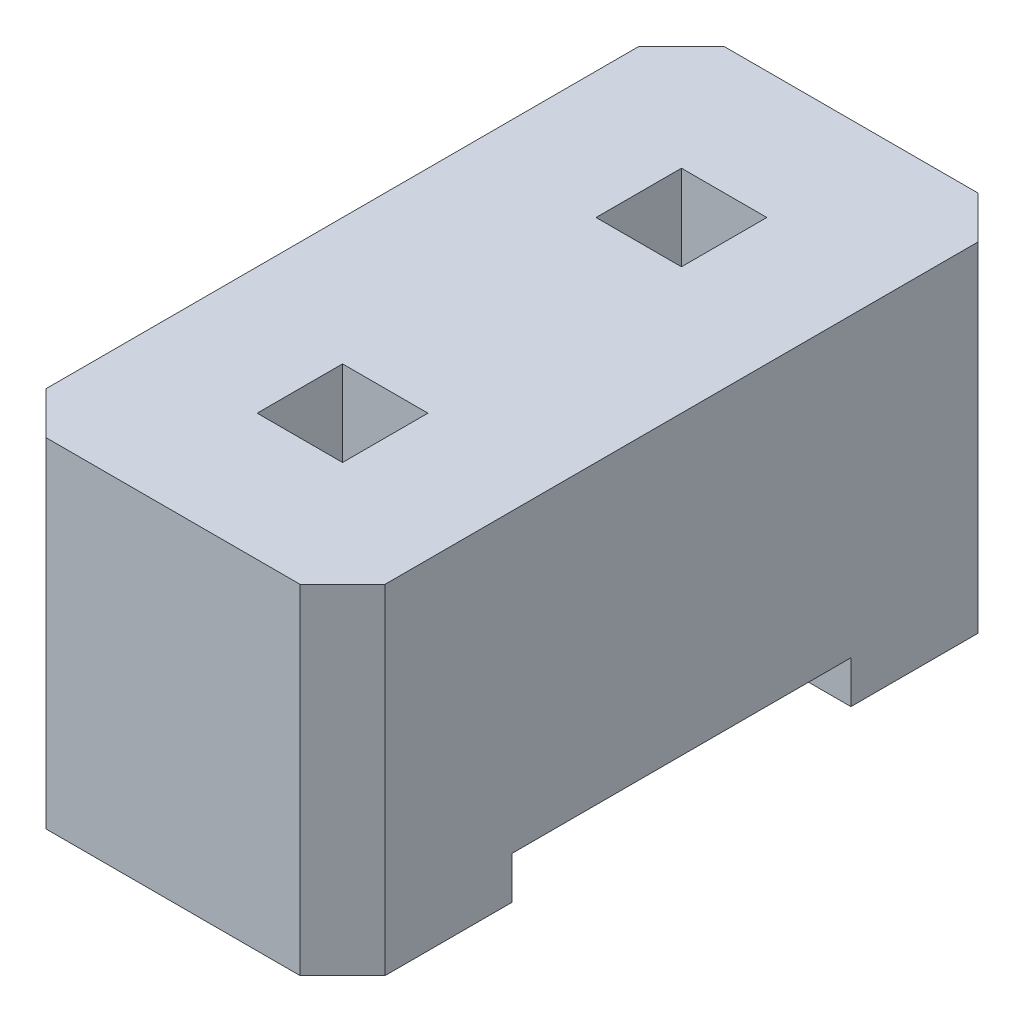
ISO-10303-21;
HEADER;
FILE_DESCRIPTION(('STEP AP214'),'2;1');
FILE_NAME('part.step','',(''),(''),'','','');
FILE_SCHEMA(('AUTOMOTIVE_DESIGN { 1 0 10303 214 1 1 1 1 }'));
ENDSEC;
DATA;
#1=APPLICATION_CONTEXT('core data for automotive mechanical design processes');
#2=APPLICATION_PROTOCOL_DEFINITION('international standard','automotive_design',2000,#1);
#3=PRODUCT_CONTEXT('',#1,'mechanical');
#4=PRODUCT('Part','Part','',(#3));
#5=PRODUCT_RELATED_PRODUCT_CATEGORY('part','',(#4));
#6=PRODUCT_DEFINITION_FORMATION('','',#4);
#7=PRODUCT_DEFINITION_CONTEXT('part definition',#1,'design');
#8=PRODUCT_DEFINITION('design','',#6,#7);
#9=PRODUCT_DEFINITION_SHAPE('','',#8);
#10=(LENGTH_UNIT() NAMED_UNIT(*) SI_UNIT(.MILLI.,.METRE.));
#11=(NAMED_UNIT(*) PLANE_ANGLE_UNIT() SI_UNIT($,.RADIAN.));
#12=(NAMED_UNIT(*) SI_UNIT($,.STERADIAN.) SOLID_ANGLE_UNIT());
#13=UNCERTAINTY_MEASURE_WITH_UNIT(LENGTH_MEASURE(1.E-05),#10,'distance_accuracy_value','');
#14=(GEOMETRIC_REPRESENTATION_CONTEXT(3) GLOBAL_UNCERTAINTY_ASSIGNED_CONTEXT((#13)) GLOBAL_UNIT_ASSIGNED_CONTEXT((#10,
#11,#12)) REPRESENTATION_CONTEXT('',''));
#15=CARTESIAN_POINT('',(0.,0.,0.));
#16=DIRECTION('',(0.,0.,1.));
#17=DIRECTION('',(1.,0.,0.));
#18=AXIS2_PLACEMENT_3D('',#15,#16,#17);
#19=CARTESIAN_POINT('',(-1.27,0.,2.54));
#20=DIRECTION('',(0.,0.,1.));
#21=DIRECTION('',(1.,0.,0.));
#22=AXIS2_PLACEMENT_3D('',#19,#20,#21);
#23=PLANE('',#22);
#24=DIRECTION('',(1.,0.,0.));
#25=VECTOR('',#24,1.);
#26=CARTESIAN_POINT('',(-1.27,0.3175,2.54));
#27=LINE('',#26,#25);
#28=CARTESIAN_POINT('',(-1.27,0.3175,2.54));
#29=VERTEX_POINT('',#28);
#30=CARTESIAN_POINT('',(-0.32,0.3175,2.54));
#31=VERTEX_POINT('',#30);
#32=EDGE_CURVE('E11',#29,#31,#27,.T.);
#33=ORIENTED_EDGE('',*,*,#32,.T.);
#34=DIRECTION('',(0.,-1.,0.));
#35=VECTOR('',#34,1.);
#36=CARTESIAN_POINT('',(-0.32,0.,2.54));
#37=LINE('',#36,#35);
#38=CARTESIAN_POINT('',(-0.32,0.,2.54));
#39=VERTEX_POINT('',#38);
#40=EDGE_CURVE('E27',#31,#39,#37,.T.);
#41=ORIENTED_EDGE('',*,*,#40,.T.);
#42=DIRECTION('',(1.,0.,0.));
#43=VECTOR('',#42,1.);
#44=CARTESIAN_POINT('',(-1.27,0.,2.54));
#45=LINE('',#44,#43);
#46=CARTESIAN_POINT('',(-1.27,0.,2.54));
#47=VERTEX_POINT('',#46);
#48=EDGE_CURVE('E298',#47,#39,#45,.T.);
#49=ORIENTED_EDGE('',*,*,#48,.F.);
#50=DIRECTION('',(0.,-1.,0.));
#51=VECTOR('',#50,1.);
#52=CARTESIAN_POINT('',(-1.27,0.,2.54));
#53=LINE('',#52,#51);
#54=EDGE_CURVE('E353',#29,#47,#53,.T.);
#55=ORIENTED_EDGE('',*,*,#54,.F.);
#56=EDGE_LOOP('',(#33,#41,#49,#55));
#57=FACE_BOUND('',#56,.T.);
#58=ADVANCED_FACE('F16',(#57),#23,.F.);
#59=CARTESIAN_POINT('',(0.,0.,0.));
#60=DIRECTION('',(0.,-1.,0.));
#61=DIRECTION('',(0.,0.,-1.));
#62=AXIS2_PLACEMENT_3D('',#59,#60,#61);
#63=PLANE('',#62);
#64=DIRECTION('',(0.,0.,1.));
#65=VECTOR('',#64,1.);
#66=CARTESIAN_POINT('',(-0.32,0.,2.86));
#67=LINE('',#66,#65);
#68=CARTESIAN_POINT('',(-0.32,0.,2.86));
#69=VERTEX_POINT('',#68);
#70=EDGE_CURVE('E312',#39,#69,#67,.T.);
#71=ORIENTED_EDGE('',*,*,#70,.T.);
#72=DIRECTION('',(1.,0.,0.));
#73=VECTOR('',#72,1.);
#74=CARTESIAN_POINT('',(-0.32,0.,2.86));
#75=LINE('',#74,#73);
#76=CARTESIAN_POINT('',(0.32,0.,2.86));
#77=VERTEX_POINT('',#76);
#78=EDGE_CURVE('E322',#69,#77,#75,.T.);
#79=ORIENTED_EDGE('',*,*,#78,.T.);
#80=DIRECTION('',(0.,0.,-1.));
#81=VECTOR('',#80,1.);
#82=CARTESIAN_POINT('',(0.32,0.,2.86));
#83=LINE('',#82,#81);
#84=CARTESIAN_POINT('',(0.32,0.,2.54));
#85=VERTEX_POINT('',#84);
#86=EDGE_CURVE('E248',#77,#85,#83,.T.);
#87=ORIENTED_EDGE('',*,*,#86,.T.);
#88=DIRECTION('',(1.,0.,0.));
#89=VECTOR('',#88,1.);
#90=CARTESIAN_POINT('',(-1.27,0.,2.54));
#91=LINE('',#90,#89);
#92=CARTESIAN_POINT('',(1.27,0.,2.54));
#93=VERTEX_POINT('',#92);
#94=EDGE_CURVE('E244',#85,#93,#91,.T.);
#95=ORIENTED_EDGE('',*,*,#94,.T.);
#96=DIRECTION('',(0.,0.,-1.));
#97=VECTOR('',#96,1.);
#98=CARTESIAN_POINT('',(1.27,0.,3.81));
#99=LINE('',#98,#97);
#100=CARTESIAN_POINT('',(1.27,0.,3.4925));
#101=VERTEX_POINT('',#100);
#102=EDGE_CURVE('E207',#101,#93,#99,.T.);
#103=ORIENTED_EDGE('',*,*,#102,.F.);
#104=DIRECTION('',(-0.70710678118655,0.,0.707106781186546));
#105=VECTOR('',#104,1.);
#106=CARTESIAN_POINT('',(2.38125,0.,2.38125));
#107=LINE('',#106,#105);
#108=CARTESIAN_POINT('',(0.9525,0.,3.81));
#109=VERTEX_POINT('',#108);
#110=EDGE_CURVE('E249',#101,#109,#107,.T.);
#111=ORIENTED_EDGE('',*,*,#110,.T.);
#112=DIRECTION('',(1.,0.,0.));
#113=VECTOR('',#112,1.);
#114=CARTESIAN_POINT('',(-1.27,0.,3.81));
#115=LINE('',#114,#113);
#116=CARTESIAN_POINT('',(-0.9525,0.,3.81));
#117=VERTEX_POINT('',#116);
#118=EDGE_CURVE('E414',#117,#109,#115,.T.);
#119=ORIENTED_EDGE('',*,*,#118,.F.);
#120=DIRECTION('',(-0.707106781186547,0.,-0.707106781186549));
#121=VECTOR('',#120,1.);
#122=CARTESIAN_POINT('',(-2.38125,0.,2.38125));
#123=LINE('',#122,#121);
#124=CARTESIAN_POINT('',(-1.27,0.,3.4925));
#125=VERTEX_POINT('',#124);
#126=EDGE_CURVE('E328',#117,#125,#123,.T.);
#127=ORIENTED_EDGE('',*,*,#126,.T.);
#128=DIRECTION('',(0.,0.,1.));
#129=VECTOR('',#128,1.);
#130=CARTESIAN_POINT('',(-1.27,0.,3.81));
#131=LINE('',#130,#129);
#132=EDGE_CURVE('E357',#47,#125,#131,.T.);
#133=ORIENTED_EDGE('',*,*,#132,.F.);
#134=ORIENTED_EDGE('',*,*,#48,.T.);
#135=EDGE_LOOP('',(#71,#79,#87,#95,#103,#111,#119,#127,#133,#134));
#136=FACE_BOUND('',#135,.T.);
#137=ADVANCED_FACE('F994',(#136),#63,.T.);
#138=CARTESIAN_POINT('',(0.,2.54,0.));
#139=DIRECTION('',(0.,-1.,0.));
#140=DIRECTION('',(0.,0.,-1.));
#141=AXIS2_PLACEMENT_3D('',#138,#139,#140);
#142=PLANE('',#141);
#143=DIRECTION('',(-1.,0.,0.));
#144=VECTOR('',#143,1.);
#145=CARTESIAN_POINT('',(-1.27,2.54,-1.27));
#146=LINE('',#145,#144);
#147=CARTESIAN_POINT('',(0.9525,2.54,-1.27));
#148=VERTEX_POINT('',#147);
#149=CARTESIAN_POINT('',(-0.9525,2.54,-1.27));
#150=VERTEX_POINT('',#149);
#151=EDGE_CURVE('E295',#148,#150,#146,.T.);
#152=ORIENTED_EDGE('',*,*,#151,.T.);
#153=DIRECTION('',(-0.707106781186549,0.,0.707106781186546));
#154=VECTOR('',#153,1.);
#155=CARTESIAN_POINT('',(-1.27,2.54,-0.9525));
#156=LINE('',#155,#154);
#157=CARTESIAN_POINT('',(-1.27,2.54,-0.9525));
#158=VERTEX_POINT('',#157);
#159=EDGE_CURVE('E242',#150,#158,#156,.T.);
#160=ORIENTED_EDGE('',*,*,#159,.T.);
#161=DIRECTION('',(0.,0.,1.));
#162=VECTOR('',#161,1.);
#163=CARTESIAN_POINT('',(-1.27,2.54,3.81));
#164=LINE('',#163,#162);
#165=CARTESIAN_POINT('',(-1.27,2.54,3.4925));
#166=VERTEX_POINT('',#165);
#167=EDGE_CURVE('E238',#158,#166,#164,.T.);
#168=ORIENTED_EDGE('',*,*,#167,.T.);
#169=DIRECTION('',(0.707106781186547,0.,0.707106781186549));
#170=VECTOR('',#169,1.);
#171=CARTESIAN_POINT('',(-0.9525,2.54,3.81));
#172=LINE('',#171,#170);
#173=CARTESIAN_POINT('',(-0.9525,2.54,3.81));
#174=VERTEX_POINT('',#173);
#175=EDGE_CURVE('E243',#166,#174,#172,.T.);
#176=ORIENTED_EDGE('',*,*,#175,.T.);
#177=DIRECTION('',(1.,0.,0.));
#178=VECTOR('',#177,1.);
#179=CARTESIAN_POINT('',(-1.27,2.54,3.81));
#180=LINE('',#179,#178);
#181=CARTESIAN_POINT('',(0.9525,2.54,3.81));
#182=VERTEX_POINT('',#181);
#183=EDGE_CURVE('E253',#174,#182,#180,.T.);
#184=ORIENTED_EDGE('',*,*,#183,.T.);
#185=DIRECTION('',(0.70710678118655,0.,-0.707106781186546));
#186=VECTOR('',#185,1.);
#187=CARTESIAN_POINT('',(1.27,2.54,3.4925));
#188=LINE('',#187,#186);
#189=CARTESIAN_POINT('',(1.27,2.54,3.4925));
#190=VERTEX_POINT('',#189);
#191=EDGE_CURVE('E231',#182,#190,#188,.T.);
#192=ORIENTED_EDGE('',*,*,#191,.T.);
#193=DIRECTION('',(0.,0.,-1.));
#194=VECTOR('',#193,1.);
#195=CARTESIAN_POINT('',(1.27,2.54,3.81));
#196=LINE('',#195,#194);
#197=CARTESIAN_POINT('',(1.27,2.54,-0.9525));
#198=VERTEX_POINT('',#197);
#199=EDGE_CURVE('E227',#190,#198,#196,.T.);
#200=ORIENTED_EDGE('',*,*,#199,.T.);
#201=DIRECTION('',(-0.707106781186547,0.,-0.707106781186549));
#202=VECTOR('',#201,1.);
#203=CARTESIAN_POINT('',(0.9525,2.54,-1.27));
#204=LINE('',#203,#202);
#205=EDGE_CURVE('E232',#198,#148,#204,.T.);
#206=ORIENTED_EDGE('',*,*,#205,.T.);
#207=EDGE_LOOP('',(#152,#160,#168,#176,#184,#192,#200,#206));
#208=FACE_BOUND('',#207,.T.);
#209=DIRECTION('',(1.,0.,0.));
#210=VECTOR('',#209,1.);
#211=CARTESIAN_POINT('',(-0.32,2.54,2.86));
#212=LINE('',#211,#210);
#213=CARTESIAN_POINT('',(-0.32,2.54,2.86));
#214=VERTEX_POINT('',#213);
#215=CARTESIAN_POINT('',(0.32,2.54,2.86));
#216=VERTEX_POINT('',#215);
#217=EDGE_CURVE('E276',#214,#216,#212,.T.);
#218=ORIENTED_EDGE('',*,*,#217,.F.);
#219=DIRECTION('',(0.,0.,1.));
#220=VECTOR('',#219,1.);
#221=CARTESIAN_POINT('',(-0.32,2.54,2.86));
#222=LINE('',#221,#220);
#223=CARTESIAN_POINT('',(-0.32,2.54,2.22));
#224=VERTEX_POINT('',#223);
#225=EDGE_CURVE('E329',#224,#214,#222,.T.);
#226=ORIENTED_EDGE('',*,*,#225,.F.);
#227=DIRECTION('',(-1.,0.,0.));
#228=VECTOR('',#227,1.);
#229=CARTESIAN_POINT('',(-0.32,2.54,2.22));
#230=LINE('',#229,#228);
#231=CARTESIAN_POINT('',(0.32,2.54,2.22));
#232=VERTEX_POINT('',#231);
#233=EDGE_CURVE('E371',#232,#224,#230,.T.);
#234=ORIENTED_EDGE('',*,*,#233,.F.);
#235=DIRECTION('',(0.,0.,-1.));
#236=VECTOR('',#235,1.);
#237=CARTESIAN_POINT('',(0.32,2.54,2.86));
#238=LINE('',#237,#236);
#239=EDGE_CURVE('E279',#216,#232,#238,.T.);
#240=ORIENTED_EDGE('',*,*,#239,.F.);
#241=EDGE_LOOP('',(#218,#226,#234,#240));
#242=FACE_BOUND('',#241,.T.);
#243=DIRECTION('',(0.,0.,-1.));
#244=VECTOR('',#243,1.);
#245=CARTESIAN_POINT('',(0.32,2.54,0.32));
#246=LINE('',#245,#244);
#247=CARTESIAN_POINT('',(0.32,2.54,0.32));
#248=VERTEX_POINT('',#247);
#249=CARTESIAN_POINT('',(0.32,2.54,-0.32));
#250=VERTEX_POINT('',#249);
#251=EDGE_CURVE('E258',#248,#250,#246,.T.);
#252=ORIENTED_EDGE('',*,*,#251,.F.);
#253=DIRECTION('',(1.,0.,0.));
#254=VECTOR('',#253,1.);
#255=CARTESIAN_POINT('',(-0.32,2.54,0.32));
#256=LINE('',#255,#254);
#257=CARTESIAN_POINT('',(-0.32,2.54,0.32));
#258=VERTEX_POINT('',#257);
#259=EDGE_CURVE('E319',#258,#248,#256,.T.);
#260=ORIENTED_EDGE('',*,*,#259,.F.);
#261=DIRECTION('',(0.,0.,1.));
#262=VECTOR('',#261,1.);
#263=CARTESIAN_POINT('',(-0.32,2.54,0.32));
#264=LINE('',#263,#262);
#265=CARTESIAN_POINT('',(-0.32,2.54,-0.32));
#266=VERTEX_POINT('',#265);
#267=EDGE_CURVE('E318',#266,#258,#264,.T.);
#268=ORIENTED_EDGE('',*,*,#267,.F.);
#269=DIRECTION('',(-1.,0.,0.));
#270=VECTOR('',#269,1.);
#271=CARTESIAN_POINT('',(-0.32,2.54,-0.32));
#272=LINE('',#271,#270);
#273=EDGE_CURVE('E281',#250,#266,#272,.T.);
#274=ORIENTED_EDGE('',*,*,#273,.F.);
#275=EDGE_LOOP('',(#252,#260,#268,#274));
#276=FACE_BOUND('',#275,.T.);
#277=ADVANCED_FACE('F984',(#208,#242,#276),#142,.F.);
#278=CARTESIAN_POINT('',(0.,0.,0.));
#279=DIRECTION('',(0.,-1.,0.));
#280=DIRECTION('',(0.,0.,-1.));
#281=AXIS2_PLACEMENT_3D('',#278,#279,#280);
#282=PLANE('',#281);
#283=DIRECTION('',(1.,0.,0.));
#284=VECTOR('',#283,1.);
#285=CARTESIAN_POINT('',(-1.27,0.,0.));
#286=LINE('',#285,#284);
#287=CARTESIAN_POINT('',(-1.27,0.,0.));
#288=VERTEX_POINT('',#287);
#289=CARTESIAN_POINT('',(-0.32,0.,0.));
#290=VERTEX_POINT('',#289);
#291=EDGE_CURVE('E372',#288,#290,#286,.T.);
#292=ORIENTED_EDGE('',*,*,#291,.F.);
#293=DIRECTION('',(0.,0.,1.));
#294=VECTOR('',#293,1.);
#295=CARTESIAN_POINT('',(-1.27,0.,3.81));
#296=LINE('',#295,#294);
#297=CARTESIAN_POINT('',(-1.27,0.,-0.9525));
#298=VERTEX_POINT('',#297);
#299=EDGE_CURVE('E264',#298,#288,#296,.T.);
#300=ORIENTED_EDGE('',*,*,#299,.F.);
#301=DIRECTION('',(0.707106781186549,0.,-0.707106781186546));
#302=VECTOR('',#301,1.);
#303=CARTESIAN_POINT('',(-1.11125,0.,-1.11125));
#304=LINE('',#303,#302);
#305=CARTESIAN_POINT('',(-0.9525,0.,-1.27));
#306=VERTEX_POINT('',#305);
#307=EDGE_CURVE('E254',#298,#306,#304,.T.);
#308=ORIENTED_EDGE('',*,*,#307,.T.);
#309=DIRECTION('',(-1.,0.,0.));
#310=VECTOR('',#309,1.);
#311=CARTESIAN_POINT('',(-1.27,0.,-1.27));
#312=LINE('',#311,#310);
#313=CARTESIAN_POINT('',(0.9525,0.,-1.27));
#314=VERTEX_POINT('',#313);
#315=EDGE_CURVE('E237',#314,#306,#312,.T.);
#316=ORIENTED_EDGE('',*,*,#315,.F.);
#317=DIRECTION('',(0.707106781186547,0.,0.707106781186549));
#318=VECTOR('',#317,1.);
#319=CARTESIAN_POINT('',(1.11125,0.,-1.11125));
#320=LINE('',#319,#318);
#321=CARTESIAN_POINT('',(1.27,0.,-0.9525));
#322=VERTEX_POINT('',#321);
#323=EDGE_CURVE('E20',#314,#322,#320,.T.);
#324=ORIENTED_EDGE('',*,*,#323,.T.);
#325=DIRECTION('',(0.,0.,-1.));
#326=VECTOR('',#325,1.);
#327=CARTESIAN_POINT('',(1.27,0.,3.81));
#328=LINE('',#327,#326);
#329=CARTESIAN_POINT('',(1.27,0.,0.));
#330=VERTEX_POINT('',#329);
#331=EDGE_CURVE('E200',#330,#322,#328,.T.);
#332=ORIENTED_EDGE('',*,*,#331,.F.);
#333=DIRECTION('',(1.,0.,0.));
#334=VECTOR('',#333,1.);
#335=CARTESIAN_POINT('',(-1.27,0.,0.));
#336=LINE('',#335,#334);
#337=CARTESIAN_POINT('',(0.32,0.,0.));
#338=VERTEX_POINT('',#337);
#339=EDGE_CURVE('E185',#338,#330,#336,.T.);
#340=ORIENTED_EDGE('',*,*,#339,.F.);
#341=DIRECTION('',(0.,0.,-1.));
#342=VECTOR('',#341,1.);
#343=CARTESIAN_POINT('',(0.32,0.,0.32));
#344=LINE('',#343,#342);
#345=CARTESIAN_POINT('',(0.32,0.,-0.32));
#346=VERTEX_POINT('',#345);
#347=EDGE_CURVE('E274',#338,#346,#344,.T.);
#348=ORIENTED_EDGE('',*,*,#347,.T.);
#349=DIRECTION('',(-1.,0.,0.));
#350=VECTOR('',#349,1.);
#351=CARTESIAN_POINT('',(-0.32,0.,-0.32));
#352=LINE('',#351,#350);
#353=CARTESIAN_POINT('',(-0.32,0.,-0.32));
#354=VERTEX_POINT('',#353);
#355=EDGE_CURVE('E270',#346,#354,#352,.T.);
#356=ORIENTED_EDGE('',*,*,#355,.T.);
#357=DIRECTION('',(0.,0.,1.));
#358=VECTOR('',#357,1.);
#359=CARTESIAN_POINT('',(-0.32,0.,0.32));
#360=LINE('',#359,#358);
#361=EDGE_CURVE('E275',#354,#290,#360,.T.);
#362=ORIENTED_EDGE('',*,*,#361,.T.);
#363=EDGE_LOOP('',(#292,#300,#308,#316,#324,#332,#340,#348,#356,#362));
#364=FACE_BOUND('',#363,.T.);
#365=ADVANCED_FACE('F201',(#364),#282,.T.);
#366=CARTESIAN_POINT('',(1.27,2.54,3.81));
#367=DIRECTION('',(-1.,0.,0.));
#368=DIRECTION('',(0.,0.,1.));
#369=AXIS2_PLACEMENT_3D('',#366,#367,#368);
#370=PLANE('',#369);
#371=ORIENTED_EDGE('',*,*,#102,.T.);
#372=DIRECTION('',(0.,-1.,0.));
#373=VECTOR('',#372,1.);
#374=CARTESIAN_POINT('',(1.27,0.,2.54));
#375=LINE('',#374,#373);
#376=CARTESIAN_POINT('',(1.27,0.3175,2.54));
#377=VERTEX_POINT('',#376);
#378=EDGE_CURVE('E349',#377,#93,#375,.T.);
#379=ORIENTED_EDGE('',*,*,#378,.F.);
#380=DIRECTION('',(0.,0.,1.));
#381=VECTOR('',#380,1.);
#382=CARTESIAN_POINT('',(1.27,0.3175,2.54));
#383=LINE('',#382,#381);
#384=CARTESIAN_POINT('',(1.27,0.3175,0.));
#385=VERTEX_POINT('',#384);
#386=EDGE_CURVE('E213',#385,#377,#383,.T.);
#387=ORIENTED_EDGE('',*,*,#386,.F.);
#388=DIRECTION('',(0.,1.,0.));
#389=VECTOR('',#388,1.);
#390=CARTESIAN_POINT('',(1.27,0.,0.));
#391=LINE('',#390,#389);
#392=EDGE_CURVE('E190',#330,#385,#391,.T.);
#393=ORIENTED_EDGE('',*,*,#392,.F.);
#394=ORIENTED_EDGE('',*,*,#331,.T.);
#395=DIRECTION('',(0.,1.,0.));
#396=VECTOR('',#395,1.);
#397=CARTESIAN_POINT('',(1.27,2.54,-0.9525));
#398=LINE('',#397,#396);
#399=EDGE_CURVE('E208',#322,#198,#398,.T.);
#400=ORIENTED_EDGE('',*,*,#399,.T.);
#401=ORIENTED_EDGE('',*,*,#199,.F.);
#402=DIRECTION('',(0.,-1.,0.));
#403=VECTOR('',#402,1.);
#404=CARTESIAN_POINT('',(1.27,2.54,3.4925));
#405=LINE('',#404,#403);
#406=EDGE_CURVE('E233',#190,#101,#405,.T.);
#407=ORIENTED_EDGE('',*,*,#406,.T.);
#408=EDGE_LOOP('',(#371,#379,#387,#393,#394,#400,#401,#407));
#409=FACE_BOUND('',#408,.T.);
#410=ADVANCED_FACE('F210',(#409),#370,.F.);
#411=CARTESIAN_POINT('',(-1.27,2.54,-1.27));
#412=DIRECTION('',(0.,0.,1.));
#413=DIRECTION('',(1.,0.,0.));
#414=AXIS2_PLACEMENT_3D('',#411,#412,#413);
#415=PLANE('',#414);
#416=ORIENTED_EDGE('',*,*,#315,.T.);
#417=DIRECTION('',(0.,1.,0.));
#418=VECTOR('',#417,1.);
#419=CARTESIAN_POINT('',(-0.9525,2.54,-1.27));
#420=LINE('',#419,#418);
#421=EDGE_CURVE('E293',#306,#150,#420,.T.);
#422=ORIENTED_EDGE('',*,*,#421,.T.);
#423=ORIENTED_EDGE('',*,*,#151,.F.);
#424=DIRECTION('',(0.,-1.,0.));
#425=VECTOR('',#424,1.);
#426=CARTESIAN_POINT('',(0.9525,2.54,-1.27));
#427=LINE('',#426,#425);
#428=EDGE_CURVE('E289',#148,#314,#427,.T.);
#429=ORIENTED_EDGE('',*,*,#428,.T.);
#430=EDGE_LOOP('',(#416,#422,#423,#429));
#431=FACE_BOUND('',#430,.T.);
#432=ADVANCED_FACE('F955',(#431),#415,.F.);
#433=CARTESIAN_POINT('',(-1.27,2.54,3.81));
#434=DIRECTION('',(1.,0.,0.));
#435=DIRECTION('',(0.,1.,0.));
#436=AXIS2_PLACEMENT_3D('',#433,#434,#435);
#437=PLANE('',#436);
#438=DIRECTION('',(0.,0.,1.));
#439=VECTOR('',#438,1.);
#440=CARTESIAN_POINT('',(-1.27,0.3175,2.54));
#441=LINE('',#440,#439);
#442=CARTESIAN_POINT('',(-1.27,0.3175,0.));
#443=VERTEX_POINT('',#442);
#444=EDGE_CURVE('E294',#443,#29,#441,.T.);
#445=ORIENTED_EDGE('',*,*,#444,.T.);
#446=ORIENTED_EDGE('',*,*,#54,.T.);
#447=ORIENTED_EDGE('',*,*,#132,.T.);
#448=DIRECTION('',(0.,1.,0.));
#449=VECTOR('',#448,1.);
#450=CARTESIAN_POINT('',(-1.27,2.54,3.4925));
#451=LINE('',#450,#449);
#452=EDGE_CURVE('E407',#125,#166,#451,.T.);
#453=ORIENTED_EDGE('',*,*,#452,.T.);
#454=ORIENTED_EDGE('',*,*,#167,.F.);
#455=DIRECTION('',(0.,-1.,0.));
#456=VECTOR('',#455,1.);
#457=CARTESIAN_POINT('',(-1.27,2.54,-0.9525));
#458=LINE('',#457,#456);
#459=EDGE_CURVE('E268',#158,#298,#458,.T.);
#460=ORIENTED_EDGE('',*,*,#459,.T.);
#461=ORIENTED_EDGE('',*,*,#299,.T.);
#462=DIRECTION('',(0.,1.,0.));
#463=VECTOR('',#462,1.);
#464=CARTESIAN_POINT('',(-1.27,0.,0.));
#465=LINE('',#464,#463);
#466=EDGE_CURVE('E269',#288,#443,#465,.T.);
#467=ORIENTED_EDGE('',*,*,#466,.T.);
#468=EDGE_LOOP('',(#445,#446,#447,#453,#454,#460,#461,#467));
#469=FACE_BOUND('',#468,.T.);
#470=ADVANCED_FACE('F944',(#469),#437,.F.);
#471=CARTESIAN_POINT('',(-1.27,2.54,3.81));
#472=DIRECTION('',(0.,0.,-1.));
#473=DIRECTION('',(0.,-1.,0.));
#474=AXIS2_PLACEMENT_3D('',#471,#472,#473);
#475=PLANE('',#474);
#476=ORIENTED_EDGE('',*,*,#183,.F.);
#477=DIRECTION('',(0.,-1.,0.));
#478=VECTOR('',#477,1.);
#479=CARTESIAN_POINT('',(-0.9525,2.54,3.81));
#480=LINE('',#479,#478);
#481=EDGE_CURVE('E288',#174,#117,#480,.T.);
#482=ORIENTED_EDGE('',*,*,#481,.T.);
#483=ORIENTED_EDGE('',*,*,#118,.T.);
#484=DIRECTION('',(0.,1.,0.));
#485=VECTOR('',#484,1.);
#486=CARTESIAN_POINT('',(0.9525,2.54,3.81));
#487=LINE('',#486,#485);
#488=EDGE_CURVE('E262',#109,#182,#487,.T.);
#489=ORIENTED_EDGE('',*,*,#488,.T.);
#490=EDGE_LOOP('',(#476,#482,#483,#489));
#491=FACE_BOUND('',#490,.T.);
#492=ADVANCED_FACE('F933',(#491),#475,.F.);
#493=CARTESIAN_POINT('',(0.32,2.54,0.32));
#494=DIRECTION('',(-1.,0.,0.));
#495=DIRECTION('',(0.,0.,1.));
#496=AXIS2_PLACEMENT_3D('',#493,#494,#495);
#497=PLANE('',#496);
#498=DIRECTION('',(0.,0.,-1.));
#499=VECTOR('',#498,1.);
#500=CARTESIAN_POINT('',(0.32,0.3175,0.32));
#501=LINE('',#500,#499);
#502=CARTESIAN_POINT('',(0.32,0.3175,0.32));
#503=VERTEX_POINT('',#502);
#504=CARTESIAN_POINT('',(0.32,0.3175,0.));
#505=VERTEX_POINT('',#504);
#506=EDGE_CURVE('E345',#503,#505,#501,.T.);
#507=ORIENTED_EDGE('',*,*,#506,.F.);
#508=DIRECTION('',(0.,-1.,0.));
#509=VECTOR('',#508,1.);
#510=CARTESIAN_POINT('',(0.32,2.54,0.32));
#511=LINE('',#510,#509);
#512=EDGE_CURVE('E360',#248,#503,#511,.T.);
#513=ORIENTED_EDGE('',*,*,#512,.F.);
#514=ORIENTED_EDGE('',*,*,#251,.T.);
#515=DIRECTION('',(0.,-1.,0.));
#516=VECTOR('',#515,1.);
#517=CARTESIAN_POINT('',(0.32,2.54,-0.32));
#518=LINE('',#517,#516);
#519=EDGE_CURVE('E263',#250,#346,#518,.T.);
#520=ORIENTED_EDGE('',*,*,#519,.T.);
#521=ORIENTED_EDGE('',*,*,#347,.F.);
#522=DIRECTION('',(0.,-1.,0.));
#523=VECTOR('',#522,1.);
#524=CARTESIAN_POINT('',(0.32,2.54,0.));
#525=LINE('',#524,#523);
#526=EDGE_CURVE('E193',#505,#338,#525,.T.);
#527=ORIENTED_EDGE('',*,*,#526,.F.);
#528=EDGE_LOOP('',(#507,#513,#514,#520,#521,#527));
#529=FACE_BOUND('',#528,.T.);
#530=ADVANCED_FACE('F922',(#529),#497,.T.);
#531=CARTESIAN_POINT('',(-0.32,2.54,-0.32));
#532=DIRECTION('',(0.,0.,1.));
#533=DIRECTION('',(1.,0.,0.));
#534=AXIS2_PLACEMENT_3D('',#531,#532,#533);
#535=PLANE('',#534);
#536=ORIENTED_EDGE('',*,*,#355,.F.);
#537=ORIENTED_EDGE('',*,*,#519,.F.);
#538=ORIENTED_EDGE('',*,*,#273,.T.);
#539=DIRECTION('',(0.,-1.,0.));
#540=VECTOR('',#539,1.);
#541=CARTESIAN_POINT('',(-0.32,2.54,-0.32));
#542=LINE('',#541,#540);
#543=EDGE_CURVE('E285',#266,#354,#542,.T.);
#544=ORIENTED_EDGE('',*,*,#543,.T.);
#545=EDGE_LOOP('',(#536,#537,#538,#544));
#546=FACE_BOUND('',#545,.T.);
#547=ADVANCED_FACE('F911',(#546),#535,.T.);
#548=CARTESIAN_POINT('',(-0.32,2.54,0.32));
#549=DIRECTION('',(1.,0.,0.));
#550=DIRECTION('',(0.,1.,0.));
#551=AXIS2_PLACEMENT_3D('',#548,#549,#550);
#552=PLANE('',#551);
#553=DIRECTION('',(0.,0.,1.));
#554=VECTOR('',#553,1.);
#555=CARTESIAN_POINT('',(-0.32,0.3175,0.32));
#556=LINE('',#555,#554);
#557=CARTESIAN_POINT('',(-0.32,0.3175,0.));
#558=VERTEX_POINT('',#557);
#559=CARTESIAN_POINT('',(-0.32,0.3175,0.32));
#560=VERTEX_POINT('',#559);
#561=EDGE_CURVE('E340',#558,#560,#556,.T.);
#562=ORIENTED_EDGE('',*,*,#561,.F.);
#563=DIRECTION('',(0.,1.,0.));
#564=VECTOR('',#563,1.);
#565=CARTESIAN_POINT('',(-0.32,2.54,0.));
#566=LINE('',#565,#564);
#567=EDGE_CURVE('E375',#290,#558,#566,.T.);
#568=ORIENTED_EDGE('',*,*,#567,.F.);
#569=ORIENTED_EDGE('',*,*,#361,.F.);
#570=ORIENTED_EDGE('',*,*,#543,.F.);
#571=ORIENTED_EDGE('',*,*,#267,.T.);
#572=DIRECTION('',(0.,-1.,0.));
#573=VECTOR('',#572,1.);
#574=CARTESIAN_POINT('',(-0.32,2.54,0.32));
#575=LINE('',#574,#573);
#576=EDGE_CURVE('E314',#258,#560,#575,.T.);
#577=ORIENTED_EDGE('',*,*,#576,.T.);
#578=EDGE_LOOP('',(#562,#568,#569,#570,#571,#577));
#579=FACE_BOUND('',#578,.T.);
#580=ADVANCED_FACE('F467',(#579),#552,.T.);
#581=CARTESIAN_POINT('',(-0.32,2.54,0.32));
#582=DIRECTION('',(0.,0.,-1.));
#583=DIRECTION('',(0.,-1.,0.));
#584=AXIS2_PLACEMENT_3D('',#581,#582,#583);
#585=PLANE('',#584);
#586=DIRECTION('',(1.,0.,0.));
#587=VECTOR('',#586,1.);
#588=CARTESIAN_POINT('',(-0.32,0.3175,0.32));
#589=LINE('',#588,#587);
#590=EDGE_CURVE('E341',#560,#503,#589,.T.);
#591=ORIENTED_EDGE('',*,*,#590,.F.);
#592=ORIENTED_EDGE('',*,*,#576,.F.);
#593=ORIENTED_EDGE('',*,*,#259,.T.);
#594=ORIENTED_EDGE('',*,*,#512,.T.);
#595=EDGE_LOOP('',(#591,#592,#593,#594));
#596=FACE_BOUND('',#595,.T.);
#597=ADVANCED_FACE('F889',(#596),#585,.T.);
#598=CARTESIAN_POINT('',(-1.27,2.54,-0.9525));
#599=DIRECTION('',(0.707106781186546,0.,0.707106781186549));
#600=DIRECTION('',(0.,-1.,0.));
#601=AXIS2_PLACEMENT_3D('',#598,#599,#600);
#602=PLANE('',#601);
#603=ORIENTED_EDGE('',*,*,#159,.F.);
#604=ORIENTED_EDGE('',*,*,#421,.F.);
#605=ORIENTED_EDGE('',*,*,#307,.F.);
#606=ORIENTED_EDGE('',*,*,#459,.F.);
#607=EDGE_LOOP('',(#603,#604,#605,#606));
#608=FACE_BOUND('',#607,.T.);
#609=ADVANCED_FACE('F878',(#608),#602,.F.);
#610=CARTESIAN_POINT('',(-0.9525,2.54,3.81));
#611=DIRECTION('',(0.707106781186549,0.,-0.707106781186547));
#612=DIRECTION('',(0.,-1.,0.));
#613=AXIS2_PLACEMENT_3D('',#610,#611,#612);
#614=PLANE('',#613);
#615=ORIENTED_EDGE('',*,*,#175,.F.);
#616=ORIENTED_EDGE('',*,*,#452,.F.);
#617=ORIENTED_EDGE('',*,*,#126,.F.);
#618=ORIENTED_EDGE('',*,*,#481,.F.);
#619=EDGE_LOOP('',(#615,#616,#617,#618));
#620=FACE_BOUND('',#619,.T.);
#621=ADVANCED_FACE('F865',(#620),#614,.F.);
#622=CARTESIAN_POINT('',(0.9525,2.54,-1.27));
#623=DIRECTION('',(-0.707106781186548,0.,0.707106781186547));
#624=DIRECTION('',(0.,1.,0.));
#625=AXIS2_PLACEMENT_3D('',#622,#623,#624);
#626=PLANE('',#625);
#627=ORIENTED_EDGE('',*,*,#205,.F.);
#628=ORIENTED_EDGE('',*,*,#399,.F.);
#629=ORIENTED_EDGE('',*,*,#323,.F.);
#630=ORIENTED_EDGE('',*,*,#428,.F.);
#631=EDGE_LOOP('',(#627,#628,#629,#630));
#632=FACE_BOUND('',#631,.T.);
#633=ADVANCED_FACE('F851',(#632),#626,.F.);
#634=CARTESIAN_POINT('',(1.27,2.54,3.4925));
#635=DIRECTION('',(-0.707106781186546,0.,-0.70710678118655));
#636=DIRECTION('',(-0.70710678118655,0.,0.707106781186546));
#637=AXIS2_PLACEMENT_3D('',#634,#635,#636);
#638=PLANE('',#637);
#639=ORIENTED_EDGE('',*,*,#191,.F.);
#640=ORIENTED_EDGE('',*,*,#488,.F.);
#641=ORIENTED_EDGE('',*,*,#110,.F.);
#642=ORIENTED_EDGE('',*,*,#406,.F.);
#643=EDGE_LOOP('',(#639,#640,#641,#642));
#644=FACE_BOUND('',#643,.T.);
#645=ADVANCED_FACE('F839',(#644),#638,.F.);
#646=CARTESIAN_POINT('',(-1.27,0.,0.));
#647=DIRECTION('',(0.,0.,-1.));
#648=DIRECTION('',(-1.,0.,0.));
#649=AXIS2_PLACEMENT_3D('',#646,#647,#648);
#650=PLANE('',#649);
#651=ORIENTED_EDGE('',*,*,#526,.T.);
#652=ORIENTED_EDGE('',*,*,#339,.T.);
#653=ORIENTED_EDGE('',*,*,#392,.T.);
#654=DIRECTION('',(1.,0.,0.));
#655=VECTOR('',#654,1.);
#656=CARTESIAN_POINT('',(-1.27,0.3175,0.));
#657=LINE('',#656,#655);
#658=EDGE_CURVE('E1295',#505,#385,#657,.T.);
#659=ORIENTED_EDGE('',*,*,#658,.F.);
#660=EDGE_LOOP('',(#651,#652,#653,#659));
#661=FACE_BOUND('',#660,.T.);
#662=ADVANCED_FACE('F187',(#661),#650,.F.);
#663=CARTESIAN_POINT('',(-1.27,0.,2.54));
#664=DIRECTION('',(0.,0.,1.));
#665=DIRECTION('',(1.,0.,0.));
#666=AXIS2_PLACEMENT_3D('',#663,#664,#665);
#667=PLANE('',#666);
#668=ORIENTED_EDGE('',*,*,#94,.F.);
#669=DIRECTION('',(0.,1.,0.));
#670=VECTOR('',#669,1.);
#671=CARTESIAN_POINT('',(0.32,0.,2.54));
#672=LINE('',#671,#670);
#673=CARTESIAN_POINT('',(0.32,0.3175,2.54));
#674=VERTEX_POINT('',#673);
#675=EDGE_CURVE('E215',#85,#674,#672,.T.);
#676=ORIENTED_EDGE('',*,*,#675,.T.);
#677=DIRECTION('',(1.,0.,0.));
#678=VECTOR('',#677,1.);
#679=CARTESIAN_POINT('',(-1.27,0.3175,2.54));
#680=LINE('',#679,#678);
#681=EDGE_CURVE('E222',#674,#377,#680,.T.);
#682=ORIENTED_EDGE('',*,*,#681,.T.);
#683=ORIENTED_EDGE('',*,*,#378,.T.);
#684=EDGE_LOOP('',(#668,#676,#682,#683));
#685=FACE_BOUND('',#684,.T.);
#686=ADVANCED_FACE('F814',(#685),#667,.F.);
#687=CARTESIAN_POINT('',(-1.27,0.3175,2.54));
#688=DIRECTION('',(0.,1.,0.));
#689=DIRECTION('',(1.,0.,0.));
#690=AXIS2_PLACEMENT_3D('',#687,#688,#689);
#691=PLANE('',#690);
#692=DIRECTION('',(-1.,0.,0.));
#693=VECTOR('',#692,1.);
#694=CARTESIAN_POINT('',(-1.27,0.3175,2.22));
#695=LINE('',#694,#693);
#696=CARTESIAN_POINT('',(0.32,0.3175,2.22));
#697=VERTEX_POINT('',#696);
#698=CARTESIAN_POINT('',(-0.32,0.3175,2.22));
#699=VERTEX_POINT('',#698);
#700=EDGE_CURVE('E380',#697,#699,#695,.T.);
#701=ORIENTED_EDGE('',*,*,#700,.T.);
#702=DIRECTION('',(0.,0.,1.));
#703=VECTOR('',#702,1.);
#704=CARTESIAN_POINT('',(-0.32,0.3175,2.54));
#705=LINE('',#704,#703);
#706=EDGE_CURVE('E339',#699,#31,#705,.T.);
#707=ORIENTED_EDGE('',*,*,#706,.T.);
#708=ORIENTED_EDGE('',*,*,#32,.F.);
#709=ORIENTED_EDGE('',*,*,#444,.F.);
#710=DIRECTION('',(1.,0.,0.));
#711=VECTOR('',#710,1.);
#712=CARTESIAN_POINT('',(-1.27,0.3175,0.));
#713=LINE('',#712,#711);
#714=EDGE_CURVE('E335',#443,#558,#713,.T.);
#715=ORIENTED_EDGE('',*,*,#714,.T.);
#716=ORIENTED_EDGE('',*,*,#561,.T.);
#717=ORIENTED_EDGE('',*,*,#590,.T.);
#718=ORIENTED_EDGE('',*,*,#506,.T.);
#719=ORIENTED_EDGE('',*,*,#658,.T.);
#720=ORIENTED_EDGE('',*,*,#386,.T.);
#721=ORIENTED_EDGE('',*,*,#681,.F.);
#722=DIRECTION('',(0.,0.,-1.));
#723=VECTOR('',#722,1.);
#724=CARTESIAN_POINT('',(0.32,0.3175,2.54));
#725=LINE('',#724,#723);
#726=EDGE_CURVE('E454',#674,#697,#725,.T.);
#727=ORIENTED_EDGE('',*,*,#726,.T.);
#728=EDGE_LOOP('',(#701,#707,#708,#709,#715,#716,#717,#718,#719,#720,#721,#727));
#729=FACE_BOUND('',#728,.T.);
#730=ADVANCED_FACE('F802',(#729),#691,.F.);
#731=CARTESIAN_POINT('',(-1.27,0.,0.));
#732=DIRECTION('',(0.,0.,-1.));
#733=DIRECTION('',(-1.,0.,0.));
#734=AXIS2_PLACEMENT_3D('',#731,#732,#733);
#735=PLANE('',#734);
#736=ORIENTED_EDGE('',*,*,#567,.T.);
#737=ORIENTED_EDGE('',*,*,#714,.F.);
#738=ORIENTED_EDGE('',*,*,#466,.F.);
#739=ORIENTED_EDGE('',*,*,#291,.T.);
#740=EDGE_LOOP('',(#736,#737,#738,#739));
#741=FACE_BOUND('',#740,.T.);
#742=ADVANCED_FACE('F791',(#741),#735,.F.);
#743=CARTESIAN_POINT('',(-0.32,0.,2.86));
#744=DIRECTION('',(-1.,0.,0.));
#745=DIRECTION('',(0.,0.,1.));
#746=AXIS2_PLACEMENT_3D('',#743,#744,#745);
#747=PLANE('',#746);
#748=ORIENTED_EDGE('',*,*,#706,.F.);
#749=DIRECTION('',(0.,1.,0.));
#750=VECTOR('',#749,1.);
#751=CARTESIAN_POINT('',(-0.32,0.,2.22));
#752=LINE('',#751,#750);
#753=EDGE_CURVE('E333',#699,#224,#752,.T.);
#754=ORIENTED_EDGE('',*,*,#753,.T.);
#755=ORIENTED_EDGE('',*,*,#225,.T.);
#756=DIRECTION('',(0.,1.,0.));
#757=VECTOR('',#756,1.);
#758=CARTESIAN_POINT('',(-0.32,0.,2.86));
#759=LINE('',#758,#757);
#760=EDGE_CURVE('E280',#69,#214,#759,.T.);
#761=ORIENTED_EDGE('',*,*,#760,.F.);
#762=ORIENTED_EDGE('',*,*,#70,.F.);
#763=ORIENTED_EDGE('',*,*,#40,.F.);
#764=EDGE_LOOP('',(#748,#754,#755,#761,#762,#763));
#765=FACE_BOUND('',#764,.T.);
#766=ADVANCED_FACE('F780',(#765),#747,.F.);
#767=CARTESIAN_POINT('',(-0.32,0.,2.22));
#768=DIRECTION('',(0.,0.,-1.));
#769=DIRECTION('',(0.,-1.,0.));
#770=AXIS2_PLACEMENT_3D('',#767,#768,#769);
#771=PLANE('',#770);
#772=DIRECTION('',(0.,1.,0.));
#773=VECTOR('',#772,1.);
#774=CARTESIAN_POINT('',(0.32,0.,2.22));
#775=LINE('',#774,#773);
#776=EDGE_CURVE('E334',#697,#232,#775,.T.);
#777=ORIENTED_EDGE('',*,*,#776,.T.);
#778=ORIENTED_EDGE('',*,*,#233,.T.);
#779=ORIENTED_EDGE('',*,*,#753,.F.);
#780=ORIENTED_EDGE('',*,*,#700,.F.);
#781=EDGE_LOOP('',(#777,#778,#779,#780));
#782=FACE_BOUND('',#781,.T.);
#783=ADVANCED_FACE('F18',(#782),#771,.F.);
#784=CARTESIAN_POINT('',(0.32,0.,2.86));
#785=DIRECTION('',(1.,0.,0.));
#786=DIRECTION('',(0.,1.,0.));
#787=AXIS2_PLACEMENT_3D('',#784,#785,#786);
#788=PLANE('',#787);
#789=ORIENTED_EDGE('',*,*,#86,.F.);
#790=DIRECTION('',(0.,1.,0.));
#791=VECTOR('',#790,1.);
#792=CARTESIAN_POINT('',(0.32,0.,2.86));
#793=LINE('',#792,#791);
#794=EDGE_CURVE('E367',#77,#216,#793,.T.);
#795=ORIENTED_EDGE('',*,*,#794,.T.);
#796=ORIENTED_EDGE('',*,*,#239,.T.);
#797=ORIENTED_EDGE('',*,*,#776,.F.);
#798=ORIENTED_EDGE('',*,*,#726,.F.);
#799=ORIENTED_EDGE('',*,*,#675,.F.);
#800=EDGE_LOOP('',(#789,#795,#796,#797,#798,#799));
#801=FACE_BOUND('',#800,.T.);
#802=ADVANCED_FACE('F754',(#801),#788,.F.);
#803=CARTESIAN_POINT('',(-0.32,0.,2.86));
#804=DIRECTION('',(0.,0.,1.));
#805=DIRECTION('',(1.,0.,0.));
#806=AXIS2_PLACEMENT_3D('',#803,#804,#805);
#807=PLANE('',#806);
#808=ORIENTED_EDGE('',*,*,#217,.T.);
#809=ORIENTED_EDGE('',*,*,#794,.F.);
#810=ORIENTED_EDGE('',*,*,#78,.F.);
#811=ORIENTED_EDGE('',*,*,#760,.T.);
#812=EDGE_LOOP('',(#808,#809,#810,#811));
#813=FACE_BOUND('',#812,.T.);
#814=ADVANCED_FACE('F748',(#813),#807,.F.);
#815=CLOSED_SHELL('',(#58,#137,#277,#365,#410,#432,#470,#492,#530,#547,#580,#597,#609,#621,#633,
#645,#662,#686,#730,#742,#766,#783,#802,#814));
#816=MANIFOLD_SOLID_BREP('B1',#815);
#817=ADVANCED_BREP_SHAPE_REPRESENTATION('',(#18,#816),#14);
#818=SHAPE_DEFINITION_REPRESENTATION(#9,#817);
ENDSEC;
END-ISO-10303-21;
